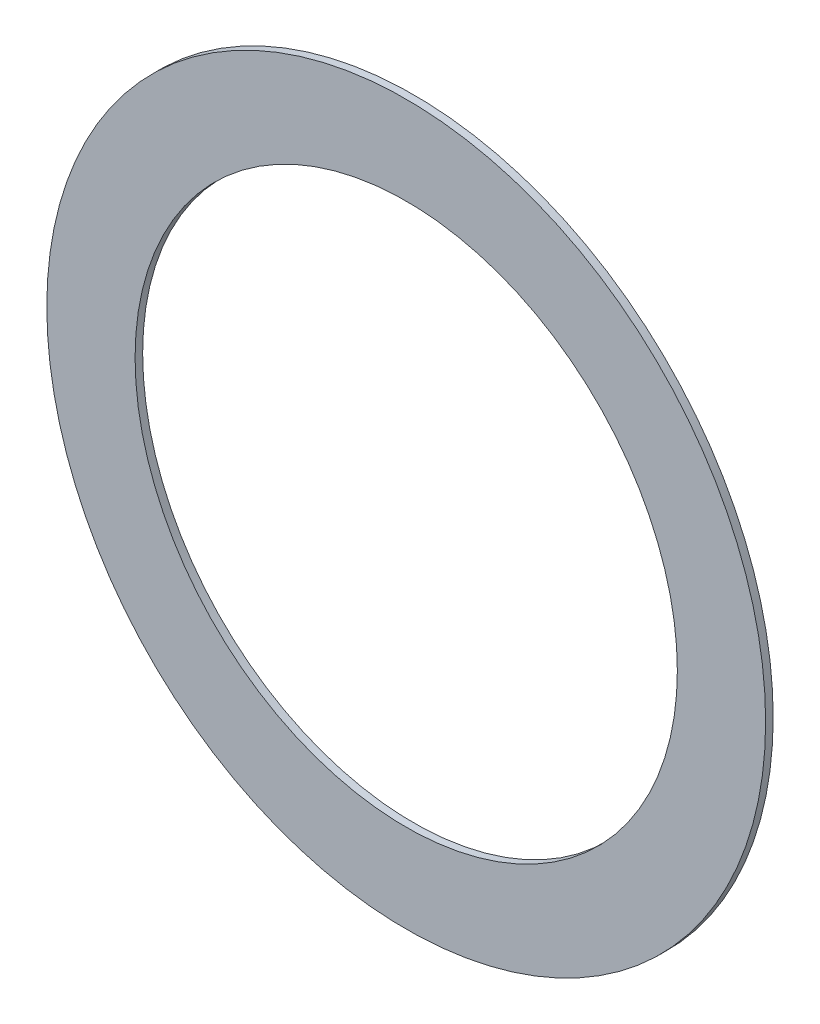
ISO-10303-21;
HEADER;
FILE_DESCRIPTION(('STEP AP214'),'2;1');
FILE_NAME('part.step','',(''),(''),'','','');
FILE_SCHEMA(('AUTOMOTIVE_DESIGN { 1 0 10303 214 1 1 1 1 }'));
ENDSEC;
DATA;
#1=APPLICATION_CONTEXT('core data for automotive mechanical design processes');
#2=APPLICATION_PROTOCOL_DEFINITION('international standard','automotive_design',2000,#1);
#3=PRODUCT_CONTEXT('',#1,'mechanical');
#4=PRODUCT('Part','Part','',(#3));
#5=PRODUCT_RELATED_PRODUCT_CATEGORY('part','',(#4));
#6=PRODUCT_DEFINITION_FORMATION('','',#4);
#7=PRODUCT_DEFINITION_CONTEXT('part definition',#1,'design');
#8=PRODUCT_DEFINITION('design','',#6,#7);
#9=PRODUCT_DEFINITION_SHAPE('','',#8);
#10=(LENGTH_UNIT() NAMED_UNIT(*) SI_UNIT(.MILLI.,.METRE.));
#11=(NAMED_UNIT(*) PLANE_ANGLE_UNIT() SI_UNIT($,.RADIAN.));
#12=(NAMED_UNIT(*) SI_UNIT($,.STERADIAN.) SOLID_ANGLE_UNIT());
#13=UNCERTAINTY_MEASURE_WITH_UNIT(LENGTH_MEASURE(1.E-05),#10,'distance_accuracy_value','');
#14=(GEOMETRIC_REPRESENTATION_CONTEXT(3) GLOBAL_UNCERTAINTY_ASSIGNED_CONTEXT((#13)) GLOBAL_UNIT_ASSIGNED_CONTEXT((#10,
#11,#12)) REPRESENTATION_CONTEXT('',''));
#15=CARTESIAN_POINT('',(0.,0.,0.));
#16=DIRECTION('',(0.,0.,1.));
#17=DIRECTION('',(1.,0.,0.));
#18=AXIS2_PLACEMENT_3D('',#15,#16,#17);
#19=CARTESIAN_POINT('',(0.,0.,0.6));
#20=DIRECTION('',(0.,0.,1.));
#21=DIRECTION('',(1.,0.,0.));
#22=AXIS2_PLACEMENT_3D('',#19,#20,#21);
#23=PLANE('',#22);
#24=CARTESIAN_POINT('',(0.,0.,0.6));
#25=DIRECTION('',(0.,0.,1.));
#26=DIRECTION('',(1.,0.,0.));
#27=AXIS2_PLACEMENT_3D('',#24,#25,#26);
#28=CIRCLE('',#27,28.5);
#29=CARTESIAN_POINT('',(28.5,0.,0.6));
#30=VERTEX_POINT('',#29);
#31=EDGE_CURVE('E10',#30,#30,#28,.T.);
#32=ORIENTED_EDGE('',*,*,#31,.T.);
#33=EDGE_LOOP('',(#32));
#34=FACE_BOUND('',#33,.T.);
#35=CARTESIAN_POINT('',(0.,0.,0.6));
#36=DIRECTION('',(0.,0.,1.));
#37=DIRECTION('',(1.,0.,0.));
#38=AXIS2_PLACEMENT_3D('',#35,#36,#37);
#39=CIRCLE('',#38,21.5);
#40=CARTESIAN_POINT('',(21.5,0.,0.6));
#41=VERTEX_POINT('',#40);
#42=EDGE_CURVE('E46',#41,#41,#39,.T.);
#43=ORIENTED_EDGE('',*,*,#42,.F.);
#44=EDGE_LOOP('',(#43));
#45=FACE_BOUND('',#44,.T.);
#46=ADVANCED_FACE('F35',(#34,#45),#23,.T.);
#47=CARTESIAN_POINT('',(0.,0.,0.));
#48=DIRECTION('',(0.,0.,1.));
#49=DIRECTION('',(1.,0.,0.));
#50=AXIS2_PLACEMENT_3D('',#47,#48,#49);
#51=PLANE('',#50);
#52=CARTESIAN_POINT('',(0.,0.,0.));
#53=DIRECTION('',(0.,0.,1.));
#54=DIRECTION('',(1.,0.,0.));
#55=AXIS2_PLACEMENT_3D('',#52,#53,#54);
#56=CIRCLE('',#55,28.5);
#57=CARTESIAN_POINT('',(28.5,0.,0.));
#58=VERTEX_POINT('',#57);
#59=EDGE_CURVE('E39',#58,#58,#56,.T.);
#60=ORIENTED_EDGE('',*,*,#59,.F.);
#61=EDGE_LOOP('',(#60));
#62=FACE_BOUND('',#61,.T.);
#63=CARTESIAN_POINT('',(0.,0.,0.));
#64=DIRECTION('',(0.,0.,1.));
#65=DIRECTION('',(1.,0.,0.));
#66=AXIS2_PLACEMENT_3D('',#63,#64,#65);
#67=CIRCLE('',#66,21.5);
#68=CARTESIAN_POINT('',(21.5,0.,0.));
#69=VERTEX_POINT('',#68);
#70=EDGE_CURVE('E48',#69,#69,#67,.T.);
#71=ORIENTED_EDGE('',*,*,#70,.T.);
#72=EDGE_LOOP('',(#71));
#73=FACE_BOUND('',#72,.T.);
#74=ADVANCED_FACE('F58',(#62,#73),#51,.F.);
#75=CARTESIAN_POINT('',(0.,0.,0.6));
#76=DIRECTION('',(0.,0.,-1.));
#77=DIRECTION('',(-1.,0.,0.));
#78=AXIS2_PLACEMENT_3D('',#75,#76,#77);
#79=CYLINDRICAL_SURFACE('',#78,28.5);
#80=ORIENTED_EDGE('',*,*,#31,.F.);
#81=EDGE_LOOP('',(#80));
#82=FACE_BOUND('',#81,.T.);
#83=ORIENTED_EDGE('',*,*,#59,.T.);
#84=EDGE_LOOP('',(#83));
#85=FACE_BOUND('',#84,.T.);
#86=ADVANCED_FACE('F37',(#82,#85),#79,.T.);
#87=CARTESIAN_POINT('',(0.,0.,0.6));
#88=DIRECTION('',(0.,0.,-1.));
#89=DIRECTION('',(-1.,0.,0.));
#90=AXIS2_PLACEMENT_3D('',#87,#88,#89);
#91=CYLINDRICAL_SURFACE('',#90,21.5);
#92=ORIENTED_EDGE('',*,*,#42,.T.);
#93=EDGE_LOOP('',(#92));
#94=FACE_BOUND('',#93,.T.);
#95=ORIENTED_EDGE('',*,*,#70,.F.);
#96=EDGE_LOOP('',(#95));
#97=FACE_BOUND('',#96,.T.);
#98=ADVANCED_FACE('F54',(#94,#97),#91,.F.);
#99=CLOSED_SHELL('',(#46,#74,#86,#98));
#100=MANIFOLD_SOLID_BREP('B2',#99);
#101=ADVANCED_BREP_SHAPE_REPRESENTATION('',(#18,#100),#14);
#102=SHAPE_DEFINITION_REPRESENTATION(#9,#101);
ENDSEC;
END-ISO-10303-21;
